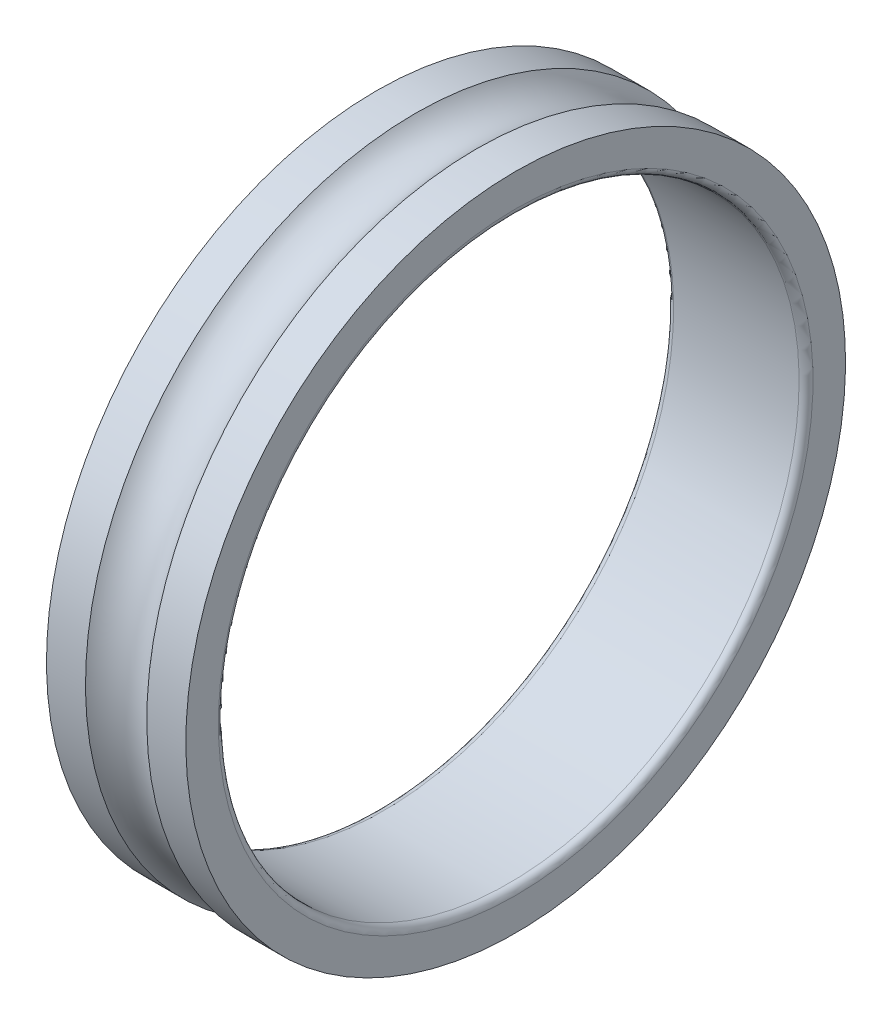
ISO-10303-21;
HEADER;
FILE_DESCRIPTION(('STEP AP214'),'2;1');
FILE_NAME('part.step','',(''),(''),'','','');
FILE_SCHEMA(('AUTOMOTIVE_DESIGN { 1 0 10303 214 1 1 1 1 }'));
ENDSEC;
DATA;
#1=APPLICATION_CONTEXT('core data for automotive mechanical design processes');
#2=APPLICATION_PROTOCOL_DEFINITION('international standard','automotive_design',2000,#1);
#3=PRODUCT_CONTEXT('',#1,'mechanical');
#4=PRODUCT('Part','Part','',(#3));
#5=PRODUCT_RELATED_PRODUCT_CATEGORY('part','',(#4));
#6=PRODUCT_DEFINITION_FORMATION('','',#4);
#7=PRODUCT_DEFINITION_CONTEXT('part definition',#1,'design');
#8=PRODUCT_DEFINITION('design','',#6,#7);
#9=PRODUCT_DEFINITION_SHAPE('','',#8);
#10=(LENGTH_UNIT() NAMED_UNIT(*) SI_UNIT(.MILLI.,.METRE.));
#11=(NAMED_UNIT(*) PLANE_ANGLE_UNIT() SI_UNIT($,.RADIAN.));
#12=(NAMED_UNIT(*) SI_UNIT($,.STERADIAN.) SOLID_ANGLE_UNIT());
#13=UNCERTAINTY_MEASURE_WITH_UNIT(LENGTH_MEASURE(1.E-05),#10,'distance_accuracy_value','');
#14=(GEOMETRIC_REPRESENTATION_CONTEXT(3) GLOBAL_UNCERTAINTY_ASSIGNED_CONTEXT((#13)) GLOBAL_UNIT_ASSIGNED_CONTEXT((#10,
#11,#12)) REPRESENTATION_CONTEXT('',''));
#15=CARTESIAN_POINT('',(0.,0.,0.));
#16=DIRECTION('',(0.,0.,1.));
#17=DIRECTION('',(1.,0.,0.));
#18=AXIS2_PLACEMENT_3D('',#15,#16,#17);
#19=CARTESIAN_POINT('',(10.3200854375759,0.,0.));
#20=DIRECTION('',(-1.,0.,0.));
#21=DIRECTION('',(0.,1.,0.));
#22=AXIS2_PLACEMENT_3D('',#19,#20,#21);
#23=CYLINDRICAL_SURFACE('',#22,28.4);
#24=CARTESIAN_POINT('',(8.64017087515182,0.,0.));
#25=DIRECTION('',(1.,0.,0.));
#26=DIRECTION('',(0.,1.,0.));
#27=AXIS2_PLACEMENT_3D('',#24,#25,#26);
#28=CIRCLE('',#27,28.4);
#29=CARTESIAN_POINT('',(8.64017087515182,28.4,0.));
#30=VERTEX_POINT('',#29);
#31=EDGE_CURVE('E11',#30,#30,#28,.T.);
#32=ORIENTED_EDGE('',*,*,#31,.T.);
#33=EDGE_LOOP('',(#32));
#34=FACE_BOUND('',#33,.T.);
#35=CARTESIAN_POINT('',(12.,0.,0.));
#36=DIRECTION('',(1.,0.,0.));
#37=DIRECTION('',(0.,1.,0.));
#38=AXIS2_PLACEMENT_3D('',#35,#36,#37);
#39=CIRCLE('',#38,28.4);
#40=CARTESIAN_POINT('',(12.,28.4,0.));
#41=VERTEX_POINT('',#40);
#42=EDGE_CURVE('E53',#41,#41,#39,.T.);
#43=ORIENTED_EDGE('',*,*,#42,.F.);
#44=EDGE_LOOP('',(#43));
#45=FACE_BOUND('',#44,.T.);
#46=ADVANCED_FACE('F16',(#34,#45),#23,.T.);
#47=CARTESIAN_POINT('',(6.,0.,0.));
#48=DIRECTION('',(1.,0.,0.));
#49=DIRECTION('',(0.,0.,-1.));
#50=AXIS2_PLACEMENT_3D('',#47,#48,#49);
#51=TOROIDAL_SURFACE('',#50,30.5,3.3735);
#52=CARTESIAN_POINT('',(3.35982912484817,0.,0.));
#53=DIRECTION('',(1.,0.,0.));
#54=DIRECTION('',(0.,1.,0.));
#55=AXIS2_PLACEMENT_3D('',#52,#53,#54);
#56=CIRCLE('',#55,28.4);
#57=CARTESIAN_POINT('',(3.35982912484817,28.4,0.));
#58=VERTEX_POINT('',#57);
#59=EDGE_CURVE('E25',#58,#58,#56,.T.);
#60=ORIENTED_EDGE('',*,*,#59,.T.);
#61=EDGE_LOOP('',(#60));
#62=FACE_BOUND('',#61,.T.);
#63=ORIENTED_EDGE('',*,*,#31,.F.);
#64=EDGE_LOOP('',(#63));
#65=FACE_BOUND('',#64,.T.);
#66=ADVANCED_FACE('F85',(#62,#65),#51,.F.);
#67=CARTESIAN_POINT('',(1.67991456242408,0.,0.));
#68=DIRECTION('',(-1.,0.,0.));
#69=DIRECTION('',(0.,1.,0.));
#70=AXIS2_PLACEMENT_3D('',#67,#68,#69);
#71=CYLINDRICAL_SURFACE('',#70,28.4);
#72=CARTESIAN_POINT('',(0.,0.,0.));
#73=DIRECTION('',(1.,0.,0.));
#74=DIRECTION('',(0.,1.,0.));
#75=AXIS2_PLACEMENT_3D('',#72,#73,#74);
#76=CIRCLE('',#75,28.4);
#77=CARTESIAN_POINT('',(0.,28.4,0.));
#78=VERTEX_POINT('',#77);
#79=EDGE_CURVE('E19',#78,#78,#76,.T.);
#80=ORIENTED_EDGE('',*,*,#79,.T.);
#81=EDGE_LOOP('',(#80));
#82=FACE_BOUND('',#81,.T.);
#83=ORIENTED_EDGE('',*,*,#59,.F.);
#84=EDGE_LOOP('',(#83));
#85=FACE_BOUND('',#84,.T.);
#86=ADVANCED_FACE('F89',(#82,#85),#71,.T.);
#87=CARTESIAN_POINT('',(0.,27.,0.));
#88=DIRECTION('',(-1.,0.,0.));
#89=DIRECTION('',(0.,-1.,0.));
#90=AXIS2_PLACEMENT_3D('',#87,#88,#89);
#91=PLANE('',#90);
#92=CARTESIAN_POINT('',(0.,0.,0.));
#93=DIRECTION('',(1.,0.,0.));
#94=DIRECTION('',(0.,1.,0.));
#95=AXIS2_PLACEMENT_3D('',#92,#93,#94);
#96=CIRCLE('',#95,25.6);
#97=CARTESIAN_POINT('',(0.,25.6,0.));
#98=VERTEX_POINT('',#97);
#99=EDGE_CURVE('E55',#98,#98,#96,.T.);
#100=ORIENTED_EDGE('',*,*,#99,.T.);
#101=EDGE_LOOP('',(#100));
#102=FACE_BOUND('',#101,.T.);
#103=ORIENTED_EDGE('',*,*,#79,.F.);
#104=EDGE_LOOP('',(#103));
#105=FACE_BOUND('',#104,.T.);
#106=ADVANCED_FACE('F95',(#102,#105),#91,.T.);
#107=CARTESIAN_POINT('',(0.6,0.,0.));
#108=DIRECTION('',(1.,0.,0.));
#109=DIRECTION('',(0.,0.,-1.));
#110=AXIS2_PLACEMENT_3D('',#107,#108,#109);
#111=TOROIDAL_SURFACE('',#110,25.6,0.6);
#112=CARTESIAN_POINT('',(0.6,0.,0.));
#113=DIRECTION('',(1.,0.,0.));
#114=DIRECTION('',(0.,1.,0.));
#115=AXIS2_PLACEMENT_3D('',#112,#113,#114);
#116=CIRCLE('',#115,25.);
#117=CARTESIAN_POINT('',(0.6,25.,0.));
#118=VERTEX_POINT('',#117);
#119=EDGE_CURVE('E52',#118,#118,#116,.T.);
#120=ORIENTED_EDGE('',*,*,#119,.T.);
#121=EDGE_LOOP('',(#120));
#122=FACE_BOUND('',#121,.T.);
#123=ORIENTED_EDGE('',*,*,#99,.F.);
#124=EDGE_LOOP('',(#123));
#125=FACE_BOUND('',#124,.T.);
#126=ADVANCED_FACE('F98',(#122,#125),#111,.T.);
#127=CARTESIAN_POINT('',(6.,0.,0.));
#128=DIRECTION('',(-1.,0.,0.));
#129=DIRECTION('',(0.,1.,0.));
#130=AXIS2_PLACEMENT_3D('',#127,#128,#129);
#131=CYLINDRICAL_SURFACE('',#130,25.);
#132=CARTESIAN_POINT('',(11.4,0.,0.));
#133=DIRECTION('',(1.,0.,0.));
#134=DIRECTION('',(0.,1.,0.));
#135=AXIS2_PLACEMENT_3D('',#132,#133,#134);
#136=CIRCLE('',#135,25.);
#137=CARTESIAN_POINT('',(11.4,25.,0.));
#138=VERTEX_POINT('',#137);
#139=EDGE_CURVE('E48',#138,#138,#136,.T.);
#140=ORIENTED_EDGE('',*,*,#139,.T.);
#141=EDGE_LOOP('',(#140));
#142=FACE_BOUND('',#141,.T.);
#143=ORIENTED_EDGE('',*,*,#119,.F.);
#144=EDGE_LOOP('',(#143));
#145=FACE_BOUND('',#144,.T.);
#146=ADVANCED_FACE('F49',(#142,#145),#131,.F.);
#147=CARTESIAN_POINT('',(11.4,0.,0.));
#148=DIRECTION('',(1.,0.,0.));
#149=DIRECTION('',(0.,0.,-1.));
#150=AXIS2_PLACEMENT_3D('',#147,#148,#149);
#151=TOROIDAL_SURFACE('',#150,25.6,0.6);
#152=CARTESIAN_POINT('',(12.,0.,0.));
#153=DIRECTION('',(1.,0.,0.));
#154=DIRECTION('',(0.,1.,0.));
#155=AXIS2_PLACEMENT_3D('',#152,#153,#154);
#156=CIRCLE('',#155,25.6);
#157=CARTESIAN_POINT('',(12.,25.6,0.));
#158=VERTEX_POINT('',#157);
#159=EDGE_CURVE('E57',#158,#158,#156,.T.);
#160=ORIENTED_EDGE('',*,*,#159,.T.);
#161=EDGE_LOOP('',(#160));
#162=FACE_BOUND('',#161,.T.);
#163=ORIENTED_EDGE('',*,*,#139,.F.);
#164=EDGE_LOOP('',(#163));
#165=FACE_BOUND('',#164,.T.);
#166=ADVANCED_FACE('F71',(#162,#165),#151,.T.);
#167=CARTESIAN_POINT('',(12.,27.,0.));
#168=DIRECTION('',(1.,0.,0.));
#169=DIRECTION('',(0.,1.,0.));
#170=AXIS2_PLACEMENT_3D('',#167,#168,#169);
#171=PLANE('',#170);
#172=ORIENTED_EDGE('',*,*,#42,.T.);
#173=EDGE_LOOP('',(#172));
#174=FACE_BOUND('',#173,.T.);
#175=ORIENTED_EDGE('',*,*,#159,.F.);
#176=EDGE_LOOP('',(#175));
#177=FACE_BOUND('',#176,.T.);
#178=ADVANCED_FACE('F73',(#174,#177),#171,.T.);
#179=CLOSED_SHELL('',(#46,#66,#86,#106,#126,#146,#166,#178));
#180=MANIFOLD_SOLID_BREP('B1',#179);
#181=ADVANCED_BREP_SHAPE_REPRESENTATION('',(#18,#180),#14);
#182=SHAPE_DEFINITION_REPRESENTATION(#9,#181);
ENDSEC;
END-ISO-10303-21;
